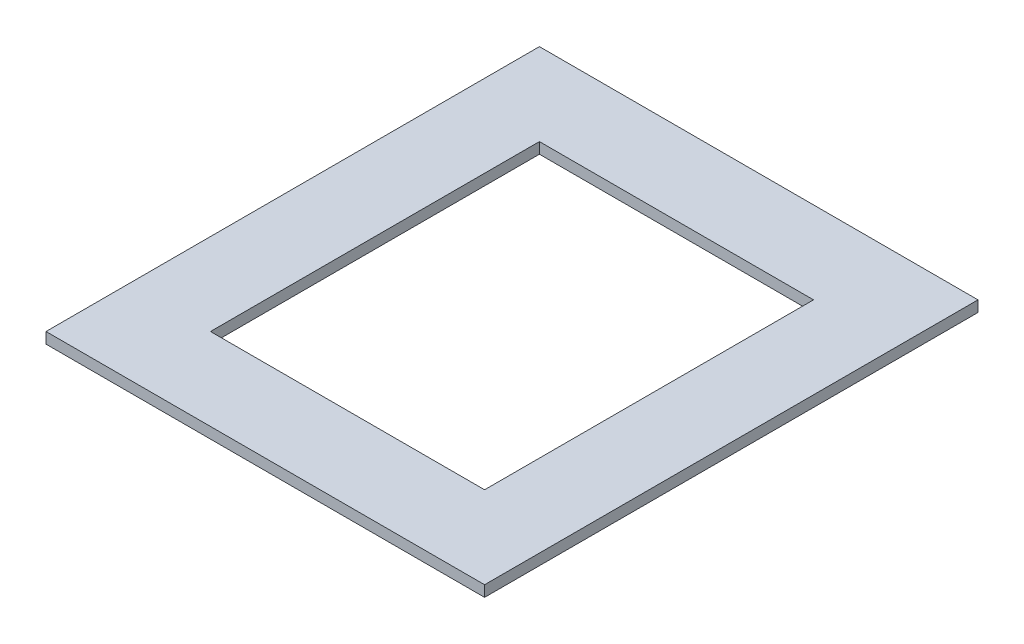
ISO-10303-21;
HEADER;
FILE_DESCRIPTION(('STEP AP214'),'2;1');
FILE_NAME('part.step','',(''),(''),'','','');
FILE_SCHEMA(('AUTOMOTIVE_DESIGN { 1 0 10303 214 1 1 1 1 }'));
ENDSEC;
DATA;
#1=APPLICATION_CONTEXT('core data for automotive mechanical design processes');
#2=APPLICATION_PROTOCOL_DEFINITION('international standard','automotive_design',2000,#1);
#3=PRODUCT_CONTEXT('',#1,'mechanical');
#4=PRODUCT('Part','Part','',(#3));
#5=PRODUCT_RELATED_PRODUCT_CATEGORY('part','',(#4));
#6=PRODUCT_DEFINITION_FORMATION('','',#4);
#7=PRODUCT_DEFINITION_CONTEXT('part definition',#1,'design');
#8=PRODUCT_DEFINITION('design','',#6,#7);
#9=PRODUCT_DEFINITION_SHAPE('','',#8);
#10=(LENGTH_UNIT() NAMED_UNIT(*) SI_UNIT(.MILLI.,.METRE.));
#11=(NAMED_UNIT(*) PLANE_ANGLE_UNIT() SI_UNIT($,.RADIAN.));
#12=(NAMED_UNIT(*) SI_UNIT($,.STERADIAN.) SOLID_ANGLE_UNIT());
#13=UNCERTAINTY_MEASURE_WITH_UNIT(LENGTH_MEASURE(1.E-05),#10,'distance_accuracy_value','');
#14=(GEOMETRIC_REPRESENTATION_CONTEXT(3) GLOBAL_UNCERTAINTY_ASSIGNED_CONTEXT((#13)) GLOBAL_UNIT_ASSIGNED_CONTEXT((#10,
#11,#12)) REPRESENTATION_CONTEXT('',''));
#15=CARTESIAN_POINT('',(0.,0.,0.));
#16=DIRECTION('',(0.,0.,1.));
#17=DIRECTION('',(1.,0.,0.));
#18=AXIS2_PLACEMENT_3D('',#15,#16,#17);
#19=CARTESIAN_POINT('',(0.,10.,0.));
#20=DIRECTION('',(-1.,0.,0.));
#21=DIRECTION('',(0.,0.,1.));
#22=AXIS2_PLACEMENT_3D('',#19,#20,#21);
#23=PLANE('',#22);
#24=DIRECTION('',(0.,0.,-1.));
#25=VECTOR('',#24,1.);
#26=CARTESIAN_POINT('',(0.,0.,0.));
#27=LINE('',#26,#25);
#28=CARTESIAN_POINT('',(0.,0.,0.));
#29=VERTEX_POINT('',#28);
#30=CARTESIAN_POINT('',(0.,0.,-450.));
#31=VERTEX_POINT('',#30);
#32=EDGE_CURVE('E129',#29,#31,#27,.T.);
#33=ORIENTED_EDGE('',*,*,#32,.T.);
#34=DIRECTION('',(0.,-1.,0.));
#35=VECTOR('',#34,1.);
#36=CARTESIAN_POINT('',(0.,10.,-450.));
#37=LINE('',#36,#35);
#38=CARTESIAN_POINT('',(0.,10.,-450.));
#39=VERTEX_POINT('',#38);
#40=EDGE_CURVE('E11',#39,#31,#37,.T.);
#41=ORIENTED_EDGE('',*,*,#40,.F.);
#42=DIRECTION('',(0.,0.,-1.));
#43=VECTOR('',#42,1.);
#44=CARTESIAN_POINT('',(0.,10.,0.));
#45=LINE('',#44,#43);
#46=CARTESIAN_POINT('',(0.,10.,0.));
#47=VERTEX_POINT('',#46);
#48=EDGE_CURVE('E133',#47,#39,#45,.T.);
#49=ORIENTED_EDGE('',*,*,#48,.F.);
#50=DIRECTION('',(0.,-1.,0.));
#51=VECTOR('',#50,1.);
#52=CARTESIAN_POINT('',(0.,10.,0.));
#53=LINE('',#52,#51);
#54=EDGE_CURVE('E143',#47,#29,#53,.T.);
#55=ORIENTED_EDGE('',*,*,#54,.T.);
#56=EDGE_LOOP('',(#33,#41,#49,#55));
#57=FACE_BOUND('',#56,.T.);
#58=ADVANCED_FACE('F32',(#57),#23,.F.);
#59=CARTESIAN_POINT('',(0.,10.,-450.));
#60=DIRECTION('',(0.,0.,1.));
#61=DIRECTION('',(1.,0.,0.));
#62=AXIS2_PLACEMENT_3D('',#59,#60,#61);
#63=PLANE('',#62);
#64=DIRECTION('',(-1.,0.,0.));
#65=VECTOR('',#64,1.);
#66=CARTESIAN_POINT('',(0.,0.,-450.));
#67=LINE('',#66,#65);
#68=CARTESIAN_POINT('',(-400.,0.,-450.));
#69=VERTEX_POINT('',#68);
#70=EDGE_CURVE('E146',#31,#69,#67,.T.);
#71=ORIENTED_EDGE('',*,*,#70,.T.);
#72=DIRECTION('',(0.,-1.,0.));
#73=VECTOR('',#72,1.);
#74=CARTESIAN_POINT('',(-400.,10.,-450.));
#75=LINE('',#74,#73);
#76=CARTESIAN_POINT('',(-400.,10.,-450.));
#77=VERTEX_POINT('',#76);
#78=EDGE_CURVE('E39',#77,#69,#75,.T.);
#79=ORIENTED_EDGE('',*,*,#78,.F.);
#80=DIRECTION('',(-1.,0.,0.));
#81=VECTOR('',#80,1.);
#82=CARTESIAN_POINT('',(0.,10.,-450.));
#83=LINE('',#82,#81);
#84=EDGE_CURVE('E136',#39,#77,#83,.T.);
#85=ORIENTED_EDGE('',*,*,#84,.F.);
#86=ORIENTED_EDGE('',*,*,#40,.T.);
#87=EDGE_LOOP('',(#71,#79,#85,#86));
#88=FACE_BOUND('',#87,.T.);
#89=ADVANCED_FACE('F174',(#88),#63,.F.);
#90=CARTESIAN_POINT('',(-400.,10.,0.));
#91=DIRECTION('',(1.,0.,0.));
#92=DIRECTION('',(0.,0.,-1.));
#93=AXIS2_PLACEMENT_3D('',#90,#91,#92);
#94=PLANE('',#93);
#95=DIRECTION('',(0.,0.,1.));
#96=VECTOR('',#95,1.);
#97=CARTESIAN_POINT('',(-400.,0.,0.));
#98=LINE('',#97,#96);
#99=CARTESIAN_POINT('',(-400.,0.,0.));
#100=VERTEX_POINT('',#99);
#101=EDGE_CURVE('E148',#69,#100,#98,.T.);
#102=ORIENTED_EDGE('',*,*,#101,.T.);
#103=DIRECTION('',(0.,-1.,0.));
#104=VECTOR('',#103,1.);
#105=CARTESIAN_POINT('',(-400.,10.,0.));
#106=LINE('',#105,#104);
#107=CARTESIAN_POINT('',(-400.,10.,0.));
#108=VERTEX_POINT('',#107);
#109=EDGE_CURVE('E153',#108,#100,#106,.T.);
#110=ORIENTED_EDGE('',*,*,#109,.F.);
#111=DIRECTION('',(0.,0.,1.));
#112=VECTOR('',#111,1.);
#113=CARTESIAN_POINT('',(-400.,10.,0.));
#114=LINE('',#113,#112);
#115=EDGE_CURVE('E139',#77,#108,#114,.T.);
#116=ORIENTED_EDGE('',*,*,#115,.F.);
#117=ORIENTED_EDGE('',*,*,#78,.T.);
#118=EDGE_LOOP('',(#102,#110,#116,#117));
#119=FACE_BOUND('',#118,.T.);
#120=ADVANCED_FACE('F160',(#119),#94,.F.);
#121=CARTESIAN_POINT('',(0.,10.,0.));
#122=DIRECTION('',(0.,0.,-1.));
#123=DIRECTION('',(-1.,0.,0.));
#124=AXIS2_PLACEMENT_3D('',#121,#122,#123);
#125=PLANE('',#124);
#126=DIRECTION('',(1.,0.,0.));
#127=VECTOR('',#126,1.);
#128=CARTESIAN_POINT('',(0.,0.,0.));
#129=LINE('',#128,#127);
#130=EDGE_CURVE('E137',#100,#29,#129,.T.);
#131=ORIENTED_EDGE('',*,*,#130,.T.);
#132=ORIENTED_EDGE('',*,*,#54,.F.);
#133=DIRECTION('',(1.,0.,0.));
#134=VECTOR('',#133,1.);
#135=CARTESIAN_POINT('',(0.,10.,0.));
#136=LINE('',#135,#134);
#137=EDGE_CURVE('E141',#108,#47,#136,.T.);
#138=ORIENTED_EDGE('',*,*,#137,.F.);
#139=ORIENTED_EDGE('',*,*,#109,.T.);
#140=EDGE_LOOP('',(#131,#132,#138,#139));
#141=FACE_BOUND('',#140,.T.);
#142=ADVANCED_FACE('F167',(#141),#125,.F.);
#143=CARTESIAN_POINT('',(0.,10.,0.));
#144=DIRECTION('',(0.,1.,0.));
#145=DIRECTION('',(0.,0.,1.));
#146=AXIS2_PLACEMENT_3D('',#143,#144,#145);
#147=PLANE('',#146);
#148=DIRECTION('',(0.,0.,1.));
#149=VECTOR('',#148,1.);
#150=CARTESIAN_POINT('',(-325.,10.,-75.));
#151=LINE('',#150,#149);
#152=CARTESIAN_POINT('',(-325.,10.,-375.));
#153=VERTEX_POINT('',#152);
#154=CARTESIAN_POINT('',(-325.,10.,-75.));
#155=VERTEX_POINT('',#154);
#156=EDGE_CURVE('E46',#153,#155,#151,.T.);
#157=ORIENTED_EDGE('',*,*,#156,.F.);
#158=DIRECTION('',(-1.,0.,0.));
#159=VECTOR('',#158,1.);
#160=CARTESIAN_POINT('',(-325.,10.,-375.));
#161=LINE('',#160,#159);
#162=CARTESIAN_POINT('',(-75.,10.,-375.));
#163=VERTEX_POINT('',#162);
#164=EDGE_CURVE('E114',#163,#153,#161,.T.);
#165=ORIENTED_EDGE('',*,*,#164,.F.);
#166=DIRECTION('',(0.,0.,-1.));
#167=VECTOR('',#166,1.);
#168=CARTESIAN_POINT('',(-75.,10.,-75.));
#169=LINE('',#168,#167);
#170=CARTESIAN_POINT('',(-75.,10.,-75.));
#171=VERTEX_POINT('',#170);
#172=EDGE_CURVE('E117',#171,#163,#169,.T.);
#173=ORIENTED_EDGE('',*,*,#172,.F.);
#174=DIRECTION('',(1.,0.,0.));
#175=VECTOR('',#174,1.);
#176=CARTESIAN_POINT('',(-325.,10.,-75.));
#177=LINE('',#176,#175);
#178=EDGE_CURVE('E123',#155,#171,#177,.T.);
#179=ORIENTED_EDGE('',*,*,#178,.F.);
#180=EDGE_LOOP('',(#157,#165,#173,#179));
#181=FACE_BOUND('',#180,.T.);
#182=ORIENTED_EDGE('',*,*,#48,.T.);
#183=ORIENTED_EDGE('',*,*,#84,.T.);
#184=ORIENTED_EDGE('',*,*,#115,.T.);
#185=ORIENTED_EDGE('',*,*,#137,.T.);
#186=EDGE_LOOP('',(#182,#183,#184,#185));
#187=FACE_BOUND('',#186,.T.);
#188=ADVANCED_FACE('F173',(#181,#187),#147,.T.);
#189=CARTESIAN_POINT('',(0.,0.,0.));
#190=DIRECTION('',(0.,1.,0.));
#191=DIRECTION('',(0.,0.,1.));
#192=AXIS2_PLACEMENT_3D('',#189,#190,#191);
#193=PLANE('',#192);
#194=DIRECTION('',(-1.,0.,0.));
#195=VECTOR('',#194,1.);
#196=CARTESIAN_POINT('',(-325.,0.,-375.));
#197=LINE('',#196,#195);
#198=CARTESIAN_POINT('',(-75.,0.,-375.));
#199=VERTEX_POINT('',#198);
#200=CARTESIAN_POINT('',(-325.,0.,-375.));
#201=VERTEX_POINT('',#200);
#202=EDGE_CURVE('E104',#199,#201,#197,.T.);
#203=ORIENTED_EDGE('',*,*,#202,.T.);
#204=DIRECTION('',(0.,0.,1.));
#205=VECTOR('',#204,1.);
#206=CARTESIAN_POINT('',(-325.,0.,-75.));
#207=LINE('',#206,#205);
#208=CARTESIAN_POINT('',(-325.,0.,-75.));
#209=VERTEX_POINT('',#208);
#210=EDGE_CURVE('E98',#201,#209,#207,.T.);
#211=ORIENTED_EDGE('',*,*,#210,.T.);
#212=DIRECTION('',(1.,0.,0.));
#213=VECTOR('',#212,1.);
#214=CARTESIAN_POINT('',(-325.,0.,-75.));
#215=LINE('',#214,#213);
#216=CARTESIAN_POINT('',(-75.,0.,-75.));
#217=VERTEX_POINT('',#216);
#218=EDGE_CURVE('E107',#209,#217,#215,.T.);
#219=ORIENTED_EDGE('',*,*,#218,.T.);
#220=DIRECTION('',(0.,0.,-1.));
#221=VECTOR('',#220,1.);
#222=CARTESIAN_POINT('',(-75.,0.,-75.));
#223=LINE('',#222,#221);
#224=EDGE_CURVE('E54',#217,#199,#223,.T.);
#225=ORIENTED_EDGE('',*,*,#224,.T.);
#226=EDGE_LOOP('',(#203,#211,#219,#225));
#227=FACE_BOUND('',#226,.T.);
#228=ORIENTED_EDGE('',*,*,#32,.F.);
#229=ORIENTED_EDGE('',*,*,#130,.F.);
#230=ORIENTED_EDGE('',*,*,#101,.F.);
#231=ORIENTED_EDGE('',*,*,#70,.F.);
#232=EDGE_LOOP('',(#228,#229,#230,#231));
#233=FACE_BOUND('',#232,.T.);
#234=ADVANCED_FACE('F111',(#227,#233),#193,.F.);
#235=CARTESIAN_POINT('',(-325.,0.,-75.));
#236=DIRECTION('',(-1.,0.,0.));
#237=DIRECTION('',(0.,0.,1.));
#238=AXIS2_PLACEMENT_3D('',#235,#236,#237);
#239=PLANE('',#238);
#240=ORIENTED_EDGE('',*,*,#156,.T.);
#241=DIRECTION('',(0.,1.,0.));
#242=VECTOR('',#241,1.);
#243=CARTESIAN_POINT('',(-325.,0.,-75.));
#244=LINE('',#243,#242);
#245=EDGE_CURVE('E94',#209,#155,#244,.T.);
#246=ORIENTED_EDGE('',*,*,#245,.F.);
#247=ORIENTED_EDGE('',*,*,#210,.F.);
#248=DIRECTION('',(0.,1.,0.));
#249=VECTOR('',#248,1.);
#250=CARTESIAN_POINT('',(-325.,0.,-375.));
#251=LINE('',#250,#249);
#252=EDGE_CURVE('E127',#201,#153,#251,.T.);
#253=ORIENTED_EDGE('',*,*,#252,.T.);
#254=EDGE_LOOP('',(#240,#246,#247,#253));
#255=FACE_BOUND('',#254,.T.);
#256=ADVANCED_FACE('F96',(#255),#239,.F.);
#257=CARTESIAN_POINT('',(-325.,0.,-375.));
#258=DIRECTION('',(0.,0.,-1.));
#259=DIRECTION('',(-1.,0.,0.));
#260=AXIS2_PLACEMENT_3D('',#257,#258,#259);
#261=PLANE('',#260);
#262=ORIENTED_EDGE('',*,*,#164,.T.);
#263=ORIENTED_EDGE('',*,*,#252,.F.);
#264=ORIENTED_EDGE('',*,*,#202,.F.);
#265=DIRECTION('',(0.,1.,0.));
#266=VECTOR('',#265,1.);
#267=CARTESIAN_POINT('',(-75.,0.,-375.));
#268=LINE('',#267,#266);
#269=EDGE_CURVE('E130',#199,#163,#268,.T.);
#270=ORIENTED_EDGE('',*,*,#269,.T.);
#271=EDGE_LOOP('',(#262,#263,#264,#270));
#272=FACE_BOUND('',#271,.T.);
#273=ADVANCED_FACE('F191',(#272),#261,.F.);
#274=CARTESIAN_POINT('',(-75.,0.,-75.));
#275=DIRECTION('',(1.,0.,0.));
#276=DIRECTION('',(0.,0.,-1.));
#277=AXIS2_PLACEMENT_3D('',#274,#275,#276);
#278=PLANE('',#277);
#279=ORIENTED_EDGE('',*,*,#172,.T.);
#280=ORIENTED_EDGE('',*,*,#269,.F.);
#281=ORIENTED_EDGE('',*,*,#224,.F.);
#282=DIRECTION('',(0.,1.,0.));
#283=VECTOR('',#282,1.);
#284=CARTESIAN_POINT('',(-75.,0.,-75.));
#285=LINE('',#284,#283);
#286=EDGE_CURVE('E103',#217,#171,#285,.T.);
#287=ORIENTED_EDGE('',*,*,#286,.T.);
#288=EDGE_LOOP('',(#279,#280,#281,#287));
#289=FACE_BOUND('',#288,.T.);
#290=ADVANCED_FACE('F194',(#289),#278,.F.);
#291=CARTESIAN_POINT('',(-325.,0.,-75.));
#292=DIRECTION('',(0.,0.,1.));
#293=DIRECTION('',(1.,0.,0.));
#294=AXIS2_PLACEMENT_3D('',#291,#292,#293);
#295=PLANE('',#294);
#296=ORIENTED_EDGE('',*,*,#178,.T.);
#297=ORIENTED_EDGE('',*,*,#286,.F.);
#298=ORIENTED_EDGE('',*,*,#218,.F.);
#299=ORIENTED_EDGE('',*,*,#245,.T.);
#300=EDGE_LOOP('',(#296,#297,#298,#299));
#301=FACE_BOUND('',#300,.T.);
#302=ADVANCED_FACE('F108',(#301),#295,.F.);
#303=CLOSED_SHELL('',(#58,#89,#120,#142,#188,#234,#256,#273,#290,#302));
#304=MANIFOLD_SOLID_BREP('B2',#303);
#305=ADVANCED_BREP_SHAPE_REPRESENTATION('',(#18,#304),#14);
#306=SHAPE_DEFINITION_REPRESENTATION(#9,#305);
ENDSEC;
END-ISO-10303-21;
